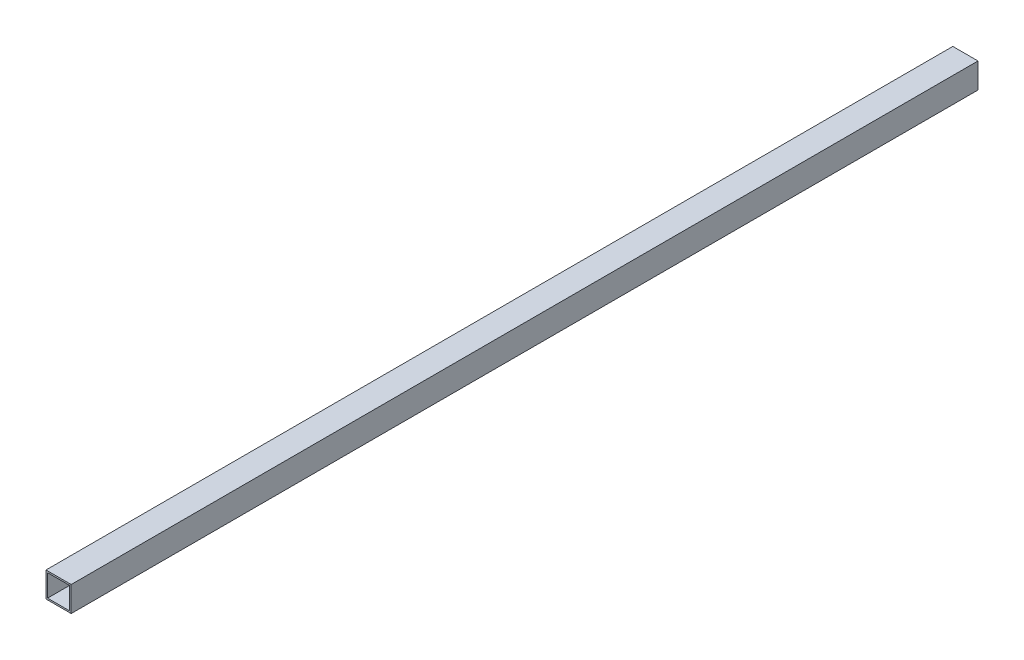
ISO-10303-21;
HEADER;
FILE_DESCRIPTION(('STEP AP214'),'2;1');
FILE_NAME('part.step','',(''),(''),'','','');
FILE_SCHEMA(('AUTOMOTIVE_DESIGN { 1 0 10303 214 1 1 1 1 }'));
ENDSEC;
DATA;
#1=APPLICATION_CONTEXT('core data for automotive mechanical design processes');
#2=APPLICATION_PROTOCOL_DEFINITION('international standard','automotive_design',2000,#1);
#3=PRODUCT_CONTEXT('',#1,'mechanical');
#4=PRODUCT('Part','Part','',(#3));
#5=PRODUCT_RELATED_PRODUCT_CATEGORY('part','',(#4));
#6=PRODUCT_DEFINITION_FORMATION('','',#4);
#7=PRODUCT_DEFINITION_CONTEXT('part definition',#1,'design');
#8=PRODUCT_DEFINITION('design','',#6,#7);
#9=PRODUCT_DEFINITION_SHAPE('','',#8);
#10=(LENGTH_UNIT() NAMED_UNIT(*) SI_UNIT(.MILLI.,.METRE.));
#11=(NAMED_UNIT(*) PLANE_ANGLE_UNIT() SI_UNIT($,.RADIAN.));
#12=(NAMED_UNIT(*) SI_UNIT($,.STERADIAN.) SOLID_ANGLE_UNIT());
#13=UNCERTAINTY_MEASURE_WITH_UNIT(LENGTH_MEASURE(1.E-05),#10,'distance_accuracy_value','');
#14=(GEOMETRIC_REPRESENTATION_CONTEXT(3) GLOBAL_UNCERTAINTY_ASSIGNED_CONTEXT((#13)) GLOBAL_UNIT_ASSIGNED_CONTEXT((#10,
#11,#12)) REPRESENTATION_CONTEXT('',''));
#15=CARTESIAN_POINT('',(0.,0.,0.));
#16=DIRECTION('',(0.,0.,1.));
#17=DIRECTION('',(1.,0.,0.));
#18=AXIS2_PLACEMENT_3D('',#15,#16,#17);
#19=CARTESIAN_POINT('',(0.,0.,457.2));
#20=DIRECTION('',(0.,0.,1.));
#21=DIRECTION('',(1.,0.,0.));
#22=AXIS2_PLACEMENT_3D('',#19,#20,#21);
#23=PLANE('',#22);
#24=DIRECTION('',(0.,-1.,0.));
#25=VECTOR('',#24,1.);
#26=CARTESIAN_POINT('',(-12.7,12.7,457.2));
#27=LINE('',#26,#25);
#28=CARTESIAN_POINT('',(-12.7,12.7,457.2));
#29=VERTEX_POINT('',#28);
#30=CARTESIAN_POINT('',(-12.7,-12.7,457.2));
#31=VERTEX_POINT('',#30);
#32=EDGE_CURVE('E119',#29,#31,#27,.T.);
#33=ORIENTED_EDGE('',*,*,#32,.T.);
#34=DIRECTION('',(1.,0.,0.));
#35=VECTOR('',#34,1.);
#36=CARTESIAN_POINT('',(-12.7,-12.7,457.2));
#37=LINE('',#36,#35);
#38=CARTESIAN_POINT('',(12.7,-12.7,457.2));
#39=VERTEX_POINT('',#38);
#40=EDGE_CURVE('E178',#31,#39,#37,.T.);
#41=ORIENTED_EDGE('',*,*,#40,.T.);
#42=DIRECTION('',(0.,1.,0.));
#43=VECTOR('',#42,1.);
#44=CARTESIAN_POINT('',(12.7,-12.7,457.2));
#45=LINE('',#44,#43);
#46=CARTESIAN_POINT('',(12.7,12.7,457.2));
#47=VERTEX_POINT('',#46);
#48=EDGE_CURVE('E181',#39,#47,#45,.T.);
#49=ORIENTED_EDGE('',*,*,#48,.T.);
#50=DIRECTION('',(-1.,0.,0.));
#51=VECTOR('',#50,1.);
#52=CARTESIAN_POINT('',(12.7,12.7,457.2));
#53=LINE('',#52,#51);
#54=EDGE_CURVE('E65',#47,#29,#53,.T.);
#55=ORIENTED_EDGE('',*,*,#54,.T.);
#56=EDGE_LOOP('',(#33,#41,#49,#55));
#57=FACE_BOUND('',#56,.T.);
#58=DIRECTION('',(1.,0.,0.));
#59=VECTOR('',#58,1.);
#60=CARTESIAN_POINT('',(-11.1125,-11.1125,457.2));
#61=LINE('',#60,#59);
#62=CARTESIAN_POINT('',(-11.1125,-11.1125,457.2));
#63=VERTEX_POINT('',#62);
#64=CARTESIAN_POINT('',(11.1125,-11.1125,457.2));
#65=VERTEX_POINT('',#64);
#66=EDGE_CURVE('E160',#63,#65,#61,.T.);
#67=ORIENTED_EDGE('',*,*,#66,.F.);
#68=DIRECTION('',(0.,-1.,0.));
#69=VECTOR('',#68,1.);
#70=CARTESIAN_POINT('',(-11.1125,11.1125,457.2));
#71=LINE('',#70,#69);
#72=CARTESIAN_POINT('',(-11.1125,11.1125,457.2));
#73=VERTEX_POINT('',#72);
#74=EDGE_CURVE('E115',#73,#63,#71,.T.);
#75=ORIENTED_EDGE('',*,*,#74,.F.);
#76=DIRECTION('',(-1.,0.,0.));
#77=VECTOR('',#76,1.);
#78=CARTESIAN_POINT('',(11.1125,11.1125,457.2));
#79=LINE('',#78,#77);
#80=CARTESIAN_POINT('',(11.1125,11.1125,457.2));
#81=VERTEX_POINT('',#80);
#82=EDGE_CURVE('E166',#81,#73,#79,.T.);
#83=ORIENTED_EDGE('',*,*,#82,.F.);
#84=DIRECTION('',(0.,1.,0.));
#85=VECTOR('',#84,1.);
#86=CARTESIAN_POINT('',(11.1125,-11.1125,457.2));
#87=LINE('',#86,#85);
#88=EDGE_CURVE('E163',#65,#81,#87,.T.);
#89=ORIENTED_EDGE('',*,*,#88,.F.);
#90=EDGE_LOOP('',(#67,#75,#83,#89));
#91=FACE_BOUND('',#90,.T.);
#92=ADVANCED_FACE('F41',(#57,#91),#23,.T.);
#93=CARTESIAN_POINT('',(-12.7,12.7,457.2));
#94=DIRECTION('',(1.,0.,0.));
#95=DIRECTION('',(0.,0.,-1.));
#96=AXIS2_PLACEMENT_3D('',#93,#94,#95);
#97=PLANE('',#96);
#98=DIRECTION('',(0.,0.,-1.));
#99=VECTOR('',#98,1.);
#100=CARTESIAN_POINT('',(-12.7,12.7,457.2));
#101=LINE('',#100,#99);
#102=CARTESIAN_POINT('',(-12.7,12.7,-457.2));
#103=VERTEX_POINT('',#102);
#104=EDGE_CURVE('E186',#29,#103,#101,.T.);
#105=ORIENTED_EDGE('',*,*,#104,.T.);
#106=DIRECTION('',(0.,-1.,0.));
#107=VECTOR('',#106,1.);
#108=CARTESIAN_POINT('',(-12.7,12.7,-457.2));
#109=LINE('',#108,#107);
#110=CARTESIAN_POINT('',(-12.7,-12.7,-457.2));
#111=VERTEX_POINT('',#110);
#112=EDGE_CURVE('E142',#103,#111,#109,.T.);
#113=ORIENTED_EDGE('',*,*,#112,.T.);
#114=DIRECTION('',(0.,0.,-1.));
#115=VECTOR('',#114,1.);
#116=CARTESIAN_POINT('',(-12.7,-12.7,457.2));
#117=LINE('',#116,#115);
#118=EDGE_CURVE('E11',#31,#111,#117,.T.);
#119=ORIENTED_EDGE('',*,*,#118,.F.);
#120=ORIENTED_EDGE('',*,*,#32,.F.);
#121=EDGE_LOOP('',(#105,#113,#119,#120));
#122=FACE_BOUND('',#121,.T.);
#123=ADVANCED_FACE('F43',(#122),#97,.F.);
#124=CARTESIAN_POINT('',(-12.7,-12.7,457.2));
#125=DIRECTION('',(0.,1.,0.));
#126=DIRECTION('',(-1.,0.,0.));
#127=AXIS2_PLACEMENT_3D('',#124,#125,#126);
#128=PLANE('',#127);
#129=ORIENTED_EDGE('',*,*,#118,.T.);
#130=DIRECTION('',(1.,0.,0.));
#131=VECTOR('',#130,1.);
#132=CARTESIAN_POINT('',(-12.7,-12.7,-457.2));
#133=LINE('',#132,#131);
#134=CARTESIAN_POINT('',(12.7,-12.7,-457.2));
#135=VERTEX_POINT('',#134);
#136=EDGE_CURVE('E146',#111,#135,#133,.T.);
#137=ORIENTED_EDGE('',*,*,#136,.T.);
#138=DIRECTION('',(0.,0.,-1.));
#139=VECTOR('',#138,1.);
#140=CARTESIAN_POINT('',(12.7,-12.7,457.2));
#141=LINE('',#140,#139);
#142=EDGE_CURVE('E50',#39,#135,#141,.T.);
#143=ORIENTED_EDGE('',*,*,#142,.F.);
#144=ORIENTED_EDGE('',*,*,#40,.F.);
#145=EDGE_LOOP('',(#129,#137,#143,#144));
#146=FACE_BOUND('',#145,.T.);
#147=ADVANCED_FACE('F202',(#146),#128,.F.);
#148=CARTESIAN_POINT('',(12.7,-12.7,457.2));
#149=DIRECTION('',(-1.,0.,0.));
#150=DIRECTION('',(0.,0.,1.));
#151=AXIS2_PLACEMENT_3D('',#148,#149,#150);
#152=PLANE('',#151);
#153=ORIENTED_EDGE('',*,*,#142,.T.);
#154=DIRECTION('',(0.,1.,0.));
#155=VECTOR('',#154,1.);
#156=CARTESIAN_POINT('',(12.7,-12.7,-457.2));
#157=LINE('',#156,#155);
#158=CARTESIAN_POINT('',(12.7,12.7,-457.2));
#159=VERTEX_POINT('',#158);
#160=EDGE_CURVE('E150',#135,#159,#157,.T.);
#161=ORIENTED_EDGE('',*,*,#160,.T.);
#162=DIRECTION('',(0.,0.,-1.));
#163=VECTOR('',#162,1.);
#164=CARTESIAN_POINT('',(12.7,12.7,457.2));
#165=LINE('',#164,#163);
#166=EDGE_CURVE('E189',#47,#159,#165,.T.);
#167=ORIENTED_EDGE('',*,*,#166,.F.);
#168=ORIENTED_EDGE('',*,*,#48,.F.);
#169=EDGE_LOOP('',(#153,#161,#167,#168));
#170=FACE_BOUND('',#169,.T.);
#171=ADVANCED_FACE('F196',(#170),#152,.F.);
#172=CARTESIAN_POINT('',(12.7,12.7,457.2));
#173=DIRECTION('',(0.,-1.,0.));
#174=DIRECTION('',(1.,0.,0.));
#175=AXIS2_PLACEMENT_3D('',#172,#173,#174);
#176=PLANE('',#175);
#177=ORIENTED_EDGE('',*,*,#166,.T.);
#178=DIRECTION('',(-1.,0.,0.));
#179=VECTOR('',#178,1.);
#180=CARTESIAN_POINT('',(12.7,12.7,-457.2));
#181=LINE('',#180,#179);
#182=EDGE_CURVE('E154',#159,#103,#181,.T.);
#183=ORIENTED_EDGE('',*,*,#182,.T.);
#184=ORIENTED_EDGE('',*,*,#104,.F.);
#185=ORIENTED_EDGE('',*,*,#54,.F.);
#186=EDGE_LOOP('',(#177,#183,#184,#185));
#187=FACE_BOUND('',#186,.T.);
#188=ADVANCED_FACE('F207',(#187),#176,.F.);
#189=CARTESIAN_POINT('',(-11.1125,11.1125,457.2));
#190=DIRECTION('',(1.,0.,0.));
#191=DIRECTION('',(0.,1.,0.));
#192=AXIS2_PLACEMENT_3D('',#189,#190,#191);
#193=PLANE('',#192);
#194=DIRECTION('',(0.,0.,-1.));
#195=VECTOR('',#194,1.);
#196=CARTESIAN_POINT('',(-11.1125,-11.1125,457.2));
#197=LINE('',#196,#195);
#198=CARTESIAN_POINT('',(-11.1125,-11.1125,-457.2));
#199=VERTEX_POINT('',#198);
#200=EDGE_CURVE('E107',#63,#199,#197,.T.);
#201=ORIENTED_EDGE('',*,*,#200,.T.);
#202=DIRECTION('',(0.,-1.,0.));
#203=VECTOR('',#202,1.);
#204=CARTESIAN_POINT('',(-11.1125,11.1125,-457.2));
#205=LINE('',#204,#203);
#206=CARTESIAN_POINT('',(-11.1125,11.1125,-457.2));
#207=VERTEX_POINT('',#206);
#208=EDGE_CURVE('E112',#207,#199,#205,.T.);
#209=ORIENTED_EDGE('',*,*,#208,.F.);
#210=DIRECTION('',(0.,0.,-1.));
#211=VECTOR('',#210,1.);
#212=CARTESIAN_POINT('',(-11.1125,11.1125,457.2));
#213=LINE('',#212,#211);
#214=EDGE_CURVE('E169',#73,#207,#213,.T.);
#215=ORIENTED_EDGE('',*,*,#214,.F.);
#216=ORIENTED_EDGE('',*,*,#74,.T.);
#217=EDGE_LOOP('',(#201,#209,#215,#216));
#218=FACE_BOUND('',#217,.T.);
#219=ADVANCED_FACE('F109',(#218),#193,.T.);
#220=CARTESIAN_POINT('',(-11.1125,-11.1125,457.2));
#221=DIRECTION('',(0.,1.,0.));
#222=DIRECTION('',(-1.,0.,0.));
#223=AXIS2_PLACEMENT_3D('',#220,#221,#222);
#224=PLANE('',#223);
#225=DIRECTION('',(0.,0.,-1.));
#226=VECTOR('',#225,1.);
#227=CARTESIAN_POINT('',(11.1125,-11.1125,457.2));
#228=LINE('',#227,#226);
#229=CARTESIAN_POINT('',(11.1125,-11.1125,-457.2));
#230=VERTEX_POINT('',#229);
#231=EDGE_CURVE('E120',#65,#230,#228,.T.);
#232=ORIENTED_EDGE('',*,*,#231,.T.);
#233=DIRECTION('',(1.,0.,0.));
#234=VECTOR('',#233,1.);
#235=CARTESIAN_POINT('',(-11.1125,-11.1125,-457.2));
#236=LINE('',#235,#234);
#237=EDGE_CURVE('E123',#199,#230,#236,.T.);
#238=ORIENTED_EDGE('',*,*,#237,.F.);
#239=ORIENTED_EDGE('',*,*,#200,.F.);
#240=ORIENTED_EDGE('',*,*,#66,.T.);
#241=EDGE_LOOP('',(#232,#238,#239,#240));
#242=FACE_BOUND('',#241,.T.);
#243=ADVANCED_FACE('F124',(#242),#224,.T.);
#244=CARTESIAN_POINT('',(11.1125,-11.1125,457.2));
#245=DIRECTION('',(-1.,0.,0.));
#246=DIRECTION('',(0.,-1.,0.));
#247=AXIS2_PLACEMENT_3D('',#244,#245,#246);
#248=PLANE('',#247);
#249=DIRECTION('',(0.,0.,-1.));
#250=VECTOR('',#249,1.);
#251=CARTESIAN_POINT('',(11.1125,11.1125,457.2));
#252=LINE('',#251,#250);
#253=CARTESIAN_POINT('',(11.1125,11.1125,-457.2));
#254=VERTEX_POINT('',#253);
#255=EDGE_CURVE('E57',#81,#254,#252,.T.);
#256=ORIENTED_EDGE('',*,*,#255,.T.);
#257=DIRECTION('',(0.,1.,0.));
#258=VECTOR('',#257,1.);
#259=CARTESIAN_POINT('',(11.1125,-11.1125,-457.2));
#260=LINE('',#259,#258);
#261=EDGE_CURVE('E130',#230,#254,#260,.T.);
#262=ORIENTED_EDGE('',*,*,#261,.F.);
#263=ORIENTED_EDGE('',*,*,#231,.F.);
#264=ORIENTED_EDGE('',*,*,#88,.T.);
#265=EDGE_LOOP('',(#256,#262,#263,#264));
#266=FACE_BOUND('',#265,.T.);
#267=ADVANCED_FACE('F225',(#266),#248,.T.);
#268=CARTESIAN_POINT('',(11.1125,11.1125,457.2));
#269=DIRECTION('',(0.,-1.,0.));
#270=DIRECTION('',(0.,0.,-1.));
#271=AXIS2_PLACEMENT_3D('',#268,#269,#270);
#272=PLANE('',#271);
#273=ORIENTED_EDGE('',*,*,#214,.T.);
#274=DIRECTION('',(-1.,0.,0.));
#275=VECTOR('',#274,1.);
#276=CARTESIAN_POINT('',(11.1125,11.1125,-457.2));
#277=LINE('',#276,#275);
#278=EDGE_CURVE('E134',#254,#207,#277,.T.);
#279=ORIENTED_EDGE('',*,*,#278,.F.);
#280=ORIENTED_EDGE('',*,*,#255,.F.);
#281=ORIENTED_EDGE('',*,*,#82,.T.);
#282=EDGE_LOOP('',(#273,#279,#280,#281));
#283=FACE_BOUND('',#282,.T.);
#284=ADVANCED_FACE('F228',(#283),#272,.T.);
#285=CARTESIAN_POINT('',(0.,0.,-457.2));
#286=DIRECTION('',(0.,0.,1.));
#287=DIRECTION('',(1.,0.,0.));
#288=AXIS2_PLACEMENT_3D('',#285,#286,#287);
#289=PLANE('',#288);
#290=ORIENTED_EDGE('',*,*,#278,.T.);
#291=ORIENTED_EDGE('',*,*,#208,.T.);
#292=ORIENTED_EDGE('',*,*,#237,.T.);
#293=ORIENTED_EDGE('',*,*,#261,.T.);
#294=EDGE_LOOP('',(#290,#291,#292,#293));
#295=FACE_BOUND('',#294,.T.);
#296=ORIENTED_EDGE('',*,*,#112,.F.);
#297=ORIENTED_EDGE('',*,*,#182,.F.);
#298=ORIENTED_EDGE('',*,*,#160,.F.);
#299=ORIENTED_EDGE('',*,*,#136,.F.);
#300=EDGE_LOOP('',(#296,#297,#298,#299));
#301=FACE_BOUND('',#300,.T.);
#302=ADVANCED_FACE('F132',(#295,#301),#289,.F.);
#303=CLOSED_SHELL('',(#92,#123,#147,#171,#188,#219,#243,#267,#284,#302));
#304=MANIFOLD_SOLID_BREP('B2',#303);
#305=ADVANCED_BREP_SHAPE_REPRESENTATION('',(#18,#304),#14);
#306=SHAPE_DEFINITION_REPRESENTATION(#9,#305);
ENDSEC;
END-ISO-10303-21;
